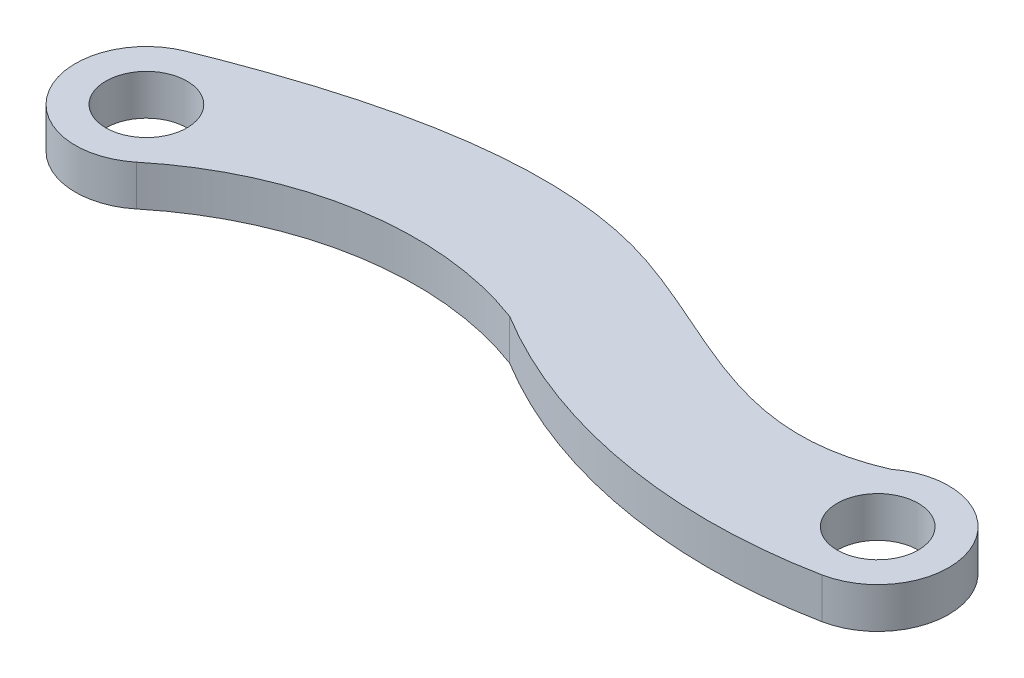
ISO-10303-21;
HEADER;
FILE_DESCRIPTION(('STEP AP214'),'2;1');
FILE_NAME('part.step','',(''),(''),'','','');
FILE_SCHEMA(('AUTOMOTIVE_DESIGN { 1 0 10303 214 1 1 1 1 }'));
ENDSEC;
DATA;
#1=APPLICATION_CONTEXT('core data for automotive mechanical design processes');
#2=APPLICATION_PROTOCOL_DEFINITION('international standard','automotive_design',2000,#1);
#3=PRODUCT_CONTEXT('',#1,'mechanical');
#4=PRODUCT('Part','Part','',(#3));
#5=PRODUCT_RELATED_PRODUCT_CATEGORY('part','',(#4));
#6=PRODUCT_DEFINITION_FORMATION('','',#4);
#7=PRODUCT_DEFINITION_CONTEXT('part definition',#1,'design');
#8=PRODUCT_DEFINITION('design','',#6,#7);
#9=PRODUCT_DEFINITION_SHAPE('','',#8);
#10=(LENGTH_UNIT() NAMED_UNIT(*) SI_UNIT(.MILLI.,.METRE.));
#11=(NAMED_UNIT(*) PLANE_ANGLE_UNIT() SI_UNIT($,.RADIAN.));
#12=(NAMED_UNIT(*) SI_UNIT($,.STERADIAN.) SOLID_ANGLE_UNIT());
#13=UNCERTAINTY_MEASURE_WITH_UNIT(LENGTH_MEASURE(1.E-05),#10,'distance_accuracy_value','');
#14=(GEOMETRIC_REPRESENTATION_CONTEXT(3) GLOBAL_UNCERTAINTY_ASSIGNED_CONTEXT((#13)) GLOBAL_UNIT_ASSIGNED_CONTEXT((#10,
#11,#12)) REPRESENTATION_CONTEXT('',''));
#15=CARTESIAN_POINT('',(0.,0.,0.));
#16=DIRECTION('',(0.,0.,1.));
#17=DIRECTION('',(1.,0.,0.));
#18=AXIS2_PLACEMENT_3D('',#15,#16,#17);
#19=CARTESIAN_POINT('',(9.41516156718863,2.,-6.46135284805365));
#20=DIRECTION('',(0.,-1.,0.));
#21=DIRECTION('',(0.,0.,-1.));
#22=AXIS2_PLACEMENT_3D('',#19,#20,#21);
#23=CYLINDRICAL_SURFACE('',#22,3.5);
#24=CARTESIAN_POINT('',(9.41516156718863,0.,-6.46135284805365));
#25=DIRECTION('',(0.,1.,0.));
#26=DIRECTION('',(0.,0.,1.));
#27=AXIS2_PLACEMENT_3D('',#24,#25,#26);
#28=CIRCLE('',#27,3.5);
#29=CARTESIAN_POINT('',(10.0907880817186,0.,-3.02718208746763));
#30=VERTEX_POINT('',#29);
#31=CARTESIAN_POINT('',(7.27645773627353,0.,-9.23190259920938));
#32=VERTEX_POINT('',#31);
#33=EDGE_CURVE('E115',#30,#32,#28,.T.);
#34=ORIENTED_EDGE('',*,*,#33,.T.);
#35=DIRECTION('',(0.,-1.,0.));
#36=VECTOR('',#35,1.);
#37=CARTESIAN_POINT('',(7.27645773627353,2.,-9.23190259920938));
#38=LINE('',#37,#36);
#39=CARTESIAN_POINT('',(7.27645773627353,2.,-9.23190259920938));
#40=VERTEX_POINT('',#39);
#41=EDGE_CURVE('E11',#40,#32,#38,.T.);
#42=ORIENTED_EDGE('',*,*,#41,.F.);
#43=CARTESIAN_POINT('',(9.41516156718863,2.,-6.46135284805365));
#44=DIRECTION('',(0.,1.,0.));
#45=DIRECTION('',(0.,0.,1.));
#46=AXIS2_PLACEMENT_3D('',#43,#44,#45);
#47=CIRCLE('',#46,3.5);
#48=CARTESIAN_POINT('',(10.0907880817186,2.,-3.02718208746763));
#49=VERTEX_POINT('',#48);
#50=EDGE_CURVE('E137',#49,#40,#47,.T.);
#51=ORIENTED_EDGE('',*,*,#50,.F.);
#52=DIRECTION('',(0.,-1.,0.));
#53=VECTOR('',#52,1.);
#54=CARTESIAN_POINT('',(10.0907880817186,2.,-3.02718208746763));
#55=LINE('',#54,#53);
#56=EDGE_CURVE('E105',#49,#30,#55,.T.);
#57=ORIENTED_EDGE('',*,*,#56,.T.);
#58=EDGE_LOOP('',(#34,#42,#51,#57));
#59=FACE_BOUND('',#58,.T.);
#60=ADVANCED_FACE('F35',(#59),#23,.T.);
#61=CARTESIAN_POINT('',(7.27645773627353,2.,-9.23190259920938));
#62=CARTESIAN_POINT('',(4.99166624843682,2.,-8.2394175161266));
#63=CARTESIAN_POINT('',(-0.384919765941948,2.,-8.39225440750092));
#64=CARTESIAN_POINT('',(-11.3003292378927,2.,-15.2338550499678));
#65=CARTESIAN_POINT('',(-22.1956917881336,2.,-12.013740113466));
#66=CARTESIAN_POINT('',(-27.9269754245699,2.,-9.71410276074742));
#67=B_SPLINE_CURVE_WITH_KNOTS('',3,(#61,#62,#63,#64,#65,#66),.UNSPECIFIED.,.F.,.F.,(4,1,1,4),
(0.0294738503466435,0.205279708915017,0.474213823064442,1.),.UNSPECIFIED.);
#68=DIRECTION('',(0.,-1.,0.));
#69=VECTOR('',#68,1.);
#70=SURFACE_OF_LINEAR_EXTRUSION('',#67,#69);
#71=CARTESIAN_POINT('',(7.27645773627353,0.,-9.23190259920938));
#72=CARTESIAN_POINT('',(4.99166624843682,0.,-8.2394175161266));
#73=CARTESIAN_POINT('',(-0.384919765941948,0.,-8.39225440750092));
#74=CARTESIAN_POINT('',(-11.3003292378927,0.,-15.2338550499678));
#75=CARTESIAN_POINT('',(-22.1956917881336,0.,-12.013740113466));
#76=CARTESIAN_POINT('',(-27.9269754245699,0.,-9.71410276074742));
#77=B_SPLINE_CURVE_WITH_KNOTS('',3,(#71,#72,#73,#74,#75,#76),.UNSPECIFIED.,.F.,.F.,(4,1,1,4),
(0.0294738503466435,0.205279708915017,0.474213823064442,1.),.UNSPECIFIED.);
#78=CARTESIAN_POINT('',(-27.9269754245699,0.,-9.71410276074742));
#79=VERTEX_POINT('',#78);
#80=EDGE_CURVE('E118',#32,#79,#77,.T.);
#81=ORIENTED_EDGE('',*,*,#80,.T.);
#82=DIRECTION('',(0.,-1.,0.));
#83=VECTOR('',#82,1.);
#84=CARTESIAN_POINT('',(-27.9269754245699,2.,-9.71410276074742));
#85=LINE('',#84,#83);
#86=CARTESIAN_POINT('',(-27.9269754245699,2.,-9.71410276074742));
#87=VERTEX_POINT('',#86);
#88=EDGE_CURVE('E44',#87,#79,#85,.T.);
#89=ORIENTED_EDGE('',*,*,#88,.F.);
#90=EDGE_CURVE('E82',#40,#87,#67,.T.);
#91=ORIENTED_EDGE('',*,*,#90,.F.);
#92=ORIENTED_EDGE('',*,*,#41,.T.);
#93=EDGE_LOOP('',(#81,#89,#91,#92));
#94=FACE_BOUND('',#93,.T.);
#95=ADVANCED_FACE('F152',(#94),#70,.F.);
#96=CARTESIAN_POINT('',(-26.6348384328114,2.,-6.46135284805365));
#97=DIRECTION('',(0.,-1.,0.));
#98=DIRECTION('',(0.,0.,-1.));
#99=AXIS2_PLACEMENT_3D('',#96,#97,#98);
#100=CYLINDRICAL_SURFACE('',#99,3.5);
#101=CARTESIAN_POINT('',(-26.6348384328114,0.,-6.46135284805365));
#102=DIRECTION('',(0.,1.,0.));
#103=DIRECTION('',(0.,0.,1.));
#104=AXIS2_PLACEMENT_3D('',#101,#102,#103);
#105=CIRCLE('',#104,3.5);
#106=CARTESIAN_POINT('',(-24.4121761833312,0.,-3.7576937488446));
#107=VERTEX_POINT('',#106);
#108=EDGE_CURVE('E98',#79,#107,#105,.T.);
#109=ORIENTED_EDGE('',*,*,#108,.T.);
#110=DIRECTION('',(0.,-1.,0.));
#111=VECTOR('',#110,1.);
#112=CARTESIAN_POINT('',(-24.4121761833312,2.,-3.7576937488446));
#113=LINE('',#112,#111);
#114=CARTESIAN_POINT('',(-24.4121761833312,2.,-3.7576937488446));
#115=VERTEX_POINT('',#114);
#116=EDGE_CURVE('E95',#115,#107,#113,.T.);
#117=ORIENTED_EDGE('',*,*,#116,.F.);
#118=CARTESIAN_POINT('',(-26.6348384328114,2.,-6.46135284805365));
#119=DIRECTION('',(0.,1.,0.));
#120=DIRECTION('',(0.,0.,1.));
#121=AXIS2_PLACEMENT_3D('',#118,#119,#120);
#122=CIRCLE('',#121,3.5);
#123=EDGE_CURVE('E86',#87,#115,#122,.T.);
#124=ORIENTED_EDGE('',*,*,#123,.F.);
#125=ORIENTED_EDGE('',*,*,#88,.T.);
#126=EDGE_LOOP('',(#109,#117,#124,#125));
#127=FACE_BOUND('',#126,.T.);
#128=ADVANCED_FACE('F96',(#127),#100,.T.);
#129=CARTESIAN_POINT('',(-14.2656765215885,2.,8.58456659323322));
#130=DIRECTION('',(0.,-1.,0.));
#131=DIRECTION('',(0.,0.,-1.));
#132=AXIS2_PLACEMENT_3D('',#129,#130,#131);
#133=CYLINDRICAL_SURFACE('',#132,15.9775732117669);
#134=CARTESIAN_POINT('',(-14.2656765215885,0.,8.58456659323322));
#135=DIRECTION('',(0.,1.,0.));
#136=DIRECTION('',(0.,0.,1.));
#137=AXIS2_PLACEMENT_3D('',#134,#135,#136);
#138=CIRCLE('',#137,15.9775732117669);
#139=CARTESIAN_POINT('',(-8.63567195995552,0.,-6.3682222561207));
#140=VERTEX_POINT('',#139);
#141=EDGE_CURVE('E126',#140,#107,#138,.T.);
#142=ORIENTED_EDGE('',*,*,#141,.F.);
#143=DIRECTION('',(0.,-1.,0.));
#144=VECTOR('',#143,1.);
#145=CARTESIAN_POINT('',(-8.63567195995552,2.,-6.3682222561207));
#146=LINE('',#145,#144);
#147=CARTESIAN_POINT('',(-8.63567195995552,2.,-6.3682222561207));
#148=VERTEX_POINT('',#147);
#149=EDGE_CURVE('E71',#148,#140,#146,.T.);
#150=ORIENTED_EDGE('',*,*,#149,.F.);
#151=CARTESIAN_POINT('',(-14.2656765215885,2.,8.58456659323322));
#152=DIRECTION('',(0.,1.,0.));
#153=DIRECTION('',(0.,0.,1.));
#154=AXIS2_PLACEMENT_3D('',#151,#152,#153);
#155=CIRCLE('',#154,15.9775732117669);
#156=EDGE_CURVE('E90',#148,#115,#155,.T.);
#157=ORIENTED_EDGE('',*,*,#156,.T.);
#158=ORIENTED_EDGE('',*,*,#116,.T.);
#159=EDGE_LOOP('',(#142,#150,#157,#158));
#160=FACE_BOUND('',#159,.T.);
#161=ADVANCED_FACE('F103',(#160),#133,.F.);
#162=CARTESIAN_POINT('',(9.41516156718863,2.,-6.46135284805365));
#163=DIRECTION('',(0.,-1.,0.));
#164=DIRECTION('',(0.,0.,-1.));
#165=AXIS2_PLACEMENT_3D('',#162,#163,#164);
#166=CYLINDRICAL_SURFACE('',#165,2.00000000570329);
#167=CARTESIAN_POINT('',(9.41516156718863,2.,-6.46135284805365));
#168=DIRECTION('',(0.,1.,0.));
#169=DIRECTION('',(0.,0.,1.));
#170=AXIS2_PLACEMENT_3D('',#167,#168,#169);
#171=CIRCLE('',#170,2.00000000570329);
#172=CARTESIAN_POINT('',(9.41516156718863,2.,-4.46135284235036));
#173=VERTEX_POINT('',#172);
#174=EDGE_CURVE('E167',#173,#173,#171,.T.);
#175=ORIENTED_EDGE('',*,*,#174,.T.);
#176=EDGE_LOOP('',(#175));
#177=FACE_BOUND('',#176,.T.);
#178=CARTESIAN_POINT('',(9.41516156718863,0.,-6.46135284805365));
#179=DIRECTION('',(0.,1.,0.));
#180=DIRECTION('',(0.,0.,1.));
#181=AXIS2_PLACEMENT_3D('',#178,#179,#180);
#182=CIRCLE('',#181,2.00000000570329);
#183=CARTESIAN_POINT('',(9.41516156718863,0.,-4.46135284235036));
#184=VERTEX_POINT('',#183);
#185=EDGE_CURVE('E112',#184,#184,#182,.T.);
#186=ORIENTED_EDGE('',*,*,#185,.F.);
#187=EDGE_LOOP('',(#186));
#188=FACE_BOUND('',#187,.T.);
#189=ADVANCED_FACE('F147',(#177,#188),#166,.F.);
#190=CARTESIAN_POINT('',(-26.6348384328114,2.,-6.46135284805365));
#191=DIRECTION('',(0.,-1.,0.));
#192=DIRECTION('',(0.,0.,-1.));
#193=AXIS2_PLACEMENT_3D('',#190,#191,#192);
#194=CYLINDRICAL_SURFACE('',#193,2.0000000057033);
#195=CARTESIAN_POINT('',(-26.6348384328114,2.,-6.46135284805365));
#196=DIRECTION('',(0.,1.,0.));
#197=DIRECTION('',(0.,0.,1.));
#198=AXIS2_PLACEMENT_3D('',#195,#196,#197);
#199=CIRCLE('',#198,2.0000000057033);
#200=CARTESIAN_POINT('',(-26.6348384328114,2.,-4.46135284235036));
#201=VERTEX_POINT('',#200);
#202=EDGE_CURVE('E129',#201,#201,#199,.T.);
#203=ORIENTED_EDGE('',*,*,#202,.T.);
#204=EDGE_LOOP('',(#203));
#205=FACE_BOUND('',#204,.T.);
#206=CARTESIAN_POINT('',(-26.6348384328114,0.,-6.46135284805365));
#207=DIRECTION('',(0.,1.,0.));
#208=DIRECTION('',(0.,0.,1.));
#209=AXIS2_PLACEMENT_3D('',#206,#207,#208);
#210=CIRCLE('',#209,2.0000000057033);
#211=CARTESIAN_POINT('',(-26.6348384328114,0.,-4.46135284235036));
#212=VERTEX_POINT('',#211);
#213=EDGE_CURVE('E109',#212,#212,#210,.T.);
#214=ORIENTED_EDGE('',*,*,#213,.F.);
#215=EDGE_LOOP('',(#214));
#216=FACE_BOUND('',#215,.T.);
#217=ADVANCED_FACE('F37',(#205,#216),#194,.F.);
#218=CARTESIAN_POINT('',(5.02420637731236,2.,-28.7803258306427));
#219=DIRECTION('',(0.,-1.,0.));
#220=DIRECTION('',(0.,0.,-1.));
#221=AXIS2_PLACEMENT_3D('',#218,#219,#220);
#222=CYLINDRICAL_SURFACE('',#221,26.2468029067173);
#223=CARTESIAN_POINT('',(5.02420637731236,0.,-28.7803258306427));
#224=DIRECTION('',(0.,1.,0.));
#225=DIRECTION('',(0.,0.,1.));
#226=AXIS2_PLACEMENT_3D('',#223,#224,#225);
#227=CIRCLE('',#226,26.2468029067173);
#228=EDGE_CURVE('E74',#140,#30,#227,.T.);
#229=ORIENTED_EDGE('',*,*,#228,.T.);
#230=ORIENTED_EDGE('',*,*,#56,.F.);
#231=CARTESIAN_POINT('',(5.02420637731236,2.,-28.7803258306427));
#232=DIRECTION('',(0.,1.,0.));
#233=DIRECTION('',(0.,0.,1.));
#234=AXIS2_PLACEMENT_3D('',#231,#232,#233);
#235=CIRCLE('',#234,26.2468029067173);
#236=EDGE_CURVE('E52',#148,#49,#235,.T.);
#237=ORIENTED_EDGE('',*,*,#236,.F.);
#238=ORIENTED_EDGE('',*,*,#149,.T.);
#239=EDGE_LOOP('',(#229,#230,#237,#238));
#240=FACE_BOUND('',#239,.T.);
#241=ADVANCED_FACE('F138',(#240),#222,.T.);
#242=CARTESIAN_POINT('',(0.,2.,0.));
#243=DIRECTION('',(0.,1.,0.));
#244=DIRECTION('',(0.,0.,1.));
#245=AXIS2_PLACEMENT_3D('',#242,#243,#244);
#246=PLANE('',#245);
#247=ORIENTED_EDGE('',*,*,#202,.F.);
#248=EDGE_LOOP('',(#247));
#249=FACE_BOUND('',#248,.T.);
#250=ORIENTED_EDGE('',*,*,#174,.F.);
#251=EDGE_LOOP('',(#250));
#252=FACE_BOUND('',#251,.T.);
#253=ORIENTED_EDGE('',*,*,#50,.T.);
#254=ORIENTED_EDGE('',*,*,#90,.T.);
#255=ORIENTED_EDGE('',*,*,#123,.T.);
#256=ORIENTED_EDGE('',*,*,#156,.F.);
#257=ORIENTED_EDGE('',*,*,#236,.T.);
#258=EDGE_LOOP('',(#253,#254,#255,#256,#257));
#259=FACE_BOUND('',#258,.T.);
#260=ADVANCED_FACE('F88',(#249,#252,#259),#246,.T.);
#261=CARTESIAN_POINT('',(0.,0.,0.));
#262=DIRECTION('',(0.,1.,0.));
#263=DIRECTION('',(0.,0.,1.));
#264=AXIS2_PLACEMENT_3D('',#261,#262,#263);
#265=PLANE('',#264);
#266=ORIENTED_EDGE('',*,*,#213,.T.);
#267=EDGE_LOOP('',(#266));
#268=FACE_BOUND('',#267,.T.);
#269=ORIENTED_EDGE('',*,*,#185,.T.);
#270=EDGE_LOOP('',(#269));
#271=FACE_BOUND('',#270,.T.);
#272=ORIENTED_EDGE('',*,*,#33,.F.);
#273=ORIENTED_EDGE('',*,*,#228,.F.);
#274=ORIENTED_EDGE('',*,*,#141,.T.);
#275=ORIENTED_EDGE('',*,*,#108,.F.);
#276=ORIENTED_EDGE('',*,*,#80,.F.);
#277=EDGE_LOOP('',(#272,#273,#274,#275,#276));
#278=FACE_BOUND('',#277,.T.);
#279=ADVANCED_FACE('F133',(#268,#271,#278),#265,.F.);
#280=CLOSED_SHELL('',(#60,#95,#128,#161,#189,#217,#241,#260,#279));
#281=MANIFOLD_SOLID_BREP('B2',#280);
#282=ADVANCED_BREP_SHAPE_REPRESENTATION('',(#18,#281),#14);
#283=SHAPE_DEFINITION_REPRESENTATION(#9,#282);
ENDSEC;
END-ISO-10303-21;
